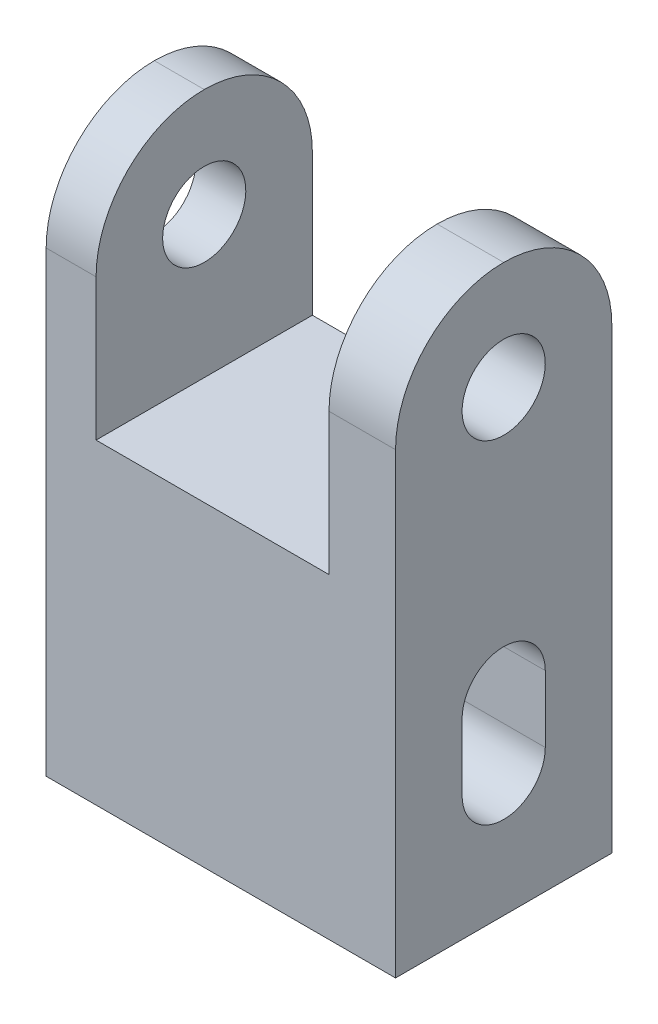
ISO-10303-21;
HEADER;
FILE_DESCRIPTION(('STEP AP214'),'2;1');
FILE_NAME('part.step','',(''),(''),'','','');
FILE_SCHEMA(('AUTOMOTIVE_DESIGN { 1 0 10303 214 1 1 1 1 }'));
ENDSEC;
DATA;
#1=APPLICATION_CONTEXT('core data for automotive mechanical design processes');
#2=APPLICATION_PROTOCOL_DEFINITION('international standard','automotive_design',2000,#1);
#3=PRODUCT_CONTEXT('',#1,'mechanical');
#4=PRODUCT('Part','Part','',(#3));
#5=PRODUCT_RELATED_PRODUCT_CATEGORY('part','',(#4));
#6=PRODUCT_DEFINITION_FORMATION('','',#4);
#7=PRODUCT_DEFINITION_CONTEXT('part definition',#1,'design');
#8=PRODUCT_DEFINITION('design','',#6,#7);
#9=PRODUCT_DEFINITION_SHAPE('','',#8);
#10=(LENGTH_UNIT() NAMED_UNIT(*) SI_UNIT(.MILLI.,.METRE.));
#11=(NAMED_UNIT(*) PLANE_ANGLE_UNIT() SI_UNIT($,.RADIAN.));
#12=(NAMED_UNIT(*) SI_UNIT($,.STERADIAN.) SOLID_ANGLE_UNIT());
#13=UNCERTAINTY_MEASURE_WITH_UNIT(LENGTH_MEASURE(1.E-05),#10,'distance_accuracy_value','');
#14=(GEOMETRIC_REPRESENTATION_CONTEXT(3) GLOBAL_UNCERTAINTY_ASSIGNED_CONTEXT((#13)) GLOBAL_UNIT_ASSIGNED_CONTEXT((#10,
#11,#12)) REPRESENTATION_CONTEXT('',''));
#15=CARTESIAN_POINT('',(0.,0.,0.));
#16=DIRECTION('',(0.,0.,1.));
#17=DIRECTION('',(1.,0.,0.));
#18=AXIS2_PLACEMENT_3D('',#15,#16,#17);
#19=CARTESIAN_POINT('',(0.,0.,13.));
#20=DIRECTION('',(1.,0.,0.));
#21=DIRECTION('',(0.,1.,0.));
#22=AXIS2_PLACEMENT_3D('',#19,#20,#21);
#23=PLANE('',#22);
#24=CARTESIAN_POINT('',(0.,-6.5,6.5));
#25=DIRECTION('',(1.,0.,0.));
#26=DIRECTION('',(0.,1.,0.));
#27=AXIS2_PLACEMENT_3D('',#24,#25,#26);
#28=CIRCLE('',#27,2.5);
#29=CARTESIAN_POINT('',(0.,-4.,6.5));
#30=VERTEX_POINT('',#29);
#31=EDGE_CURVE('E231',#30,#30,#28,.T.);
#32=ORIENTED_EDGE('',*,*,#31,.T.);
#33=EDGE_LOOP('',(#32));
#34=FACE_BOUND('',#33,.T.);
#35=DIRECTION('',(0.,1.,0.));
#36=VECTOR('',#35,1.);
#37=CARTESIAN_POINT('',(0.,-26.5,9.));
#38=LINE('',#37,#36);
#39=CARTESIAN_POINT('',(0.,-26.5,9.));
#40=VERTEX_POINT('',#39);
#41=CARTESIAN_POINT('',(0.,-22.5,9.));
#42=VERTEX_POINT('',#41);
#43=EDGE_CURVE('E178',#40,#42,#38,.T.);
#44=ORIENTED_EDGE('',*,*,#43,.F.);
#45=CARTESIAN_POINT('',(0.,-26.5,6.5));
#46=DIRECTION('',(-1.,0.,0.));
#47=DIRECTION('',(0.,-1.,0.));
#48=AXIS2_PLACEMENT_3D('',#45,#46,#47);
#49=CIRCLE('',#48,2.5);
#50=CARTESIAN_POINT('',(0.,-26.5,4.));
#51=VERTEX_POINT('',#50);
#52=EDGE_CURVE('E149',#51,#40,#49,.T.);
#53=ORIENTED_EDGE('',*,*,#52,.F.);
#54=DIRECTION('',(0.,1.,0.));
#55=VECTOR('',#54,1.);
#56=CARTESIAN_POINT('',(0.,-26.5,4.));
#57=LINE('',#56,#55);
#58=CARTESIAN_POINT('',(0.,-22.5,4.));
#59=VERTEX_POINT('',#58);
#60=EDGE_CURVE('E166',#51,#59,#57,.T.);
#61=ORIENTED_EDGE('',*,*,#60,.T.);
#62=CARTESIAN_POINT('',(0.,-22.5,6.5));
#63=DIRECTION('',(-1.,0.,0.));
#64=DIRECTION('',(0.,-1.,0.));
#65=AXIS2_PLACEMENT_3D('',#62,#63,#64);
#66=CIRCLE('',#65,2.5);
#67=EDGE_CURVE('E169',#42,#59,#66,.T.);
#68=ORIENTED_EDGE('',*,*,#67,.F.);
#69=EDGE_LOOP('',(#44,#53,#61,#68));
#70=FACE_BOUND('',#69,.T.);
#71=DIRECTION('',(0.,-1.,0.));
#72=VECTOR('',#71,1.);
#73=CARTESIAN_POINT('',(0.,0.,13.));
#74=LINE('',#73,#72);
#75=CARTESIAN_POINT('',(0.,-6.5,13.));
#76=VERTEX_POINT('',#75);
#77=CARTESIAN_POINT('',(0.,-34.,13.));
#78=VERTEX_POINT('',#77);
#79=EDGE_CURVE('E188',#76,#78,#74,.T.);
#80=ORIENTED_EDGE('',*,*,#79,.F.);
#81=CARTESIAN_POINT('',(0.,-6.5,6.5));
#82=DIRECTION('',(1.,0.,0.));
#83=DIRECTION('',(0.,1.,0.));
#84=AXIS2_PLACEMENT_3D('',#81,#82,#83);
#85=CIRCLE('',#84,6.5);
#86=CARTESIAN_POINT('',(0.,0.,6.5));
#87=VERTEX_POINT('',#86);
#88=EDGE_CURVE('E247',#76,#87,#85,.F.);
#89=ORIENTED_EDGE('',*,*,#88,.T.);
#90=CARTESIAN_POINT('',(0.,-6.5,6.5));
#91=DIRECTION('',(1.,0.,0.));
#92=DIRECTION('',(0.,1.,0.));
#93=AXIS2_PLACEMENT_3D('',#90,#91,#92);
#94=CIRCLE('',#93,6.5);
#95=CARTESIAN_POINT('',(0.,-6.5,0.));
#96=VERTEX_POINT('',#95);
#97=EDGE_CURVE('E245',#87,#96,#94,.F.);
#98=ORIENTED_EDGE('',*,*,#97,.T.);
#99=DIRECTION('',(0.,-1.,0.));
#100=VECTOR('',#99,1.);
#101=CARTESIAN_POINT('',(0.,0.,0.));
#102=LINE('',#101,#100);
#103=CARTESIAN_POINT('',(0.,-34.,0.));
#104=VERTEX_POINT('',#103);
#105=EDGE_CURVE('E184',#96,#104,#102,.T.);
#106=ORIENTED_EDGE('',*,*,#105,.T.);
#107=DIRECTION('',(0.,0.,-1.));
#108=VECTOR('',#107,1.);
#109=CARTESIAN_POINT('',(0.,-34.,13.));
#110=LINE('',#109,#108);
#111=EDGE_CURVE('E223',#78,#104,#110,.T.);
#112=ORIENTED_EDGE('',*,*,#111,.F.);
#113=EDGE_LOOP('',(#80,#89,#98,#106,#112));
#114=FACE_BOUND('',#113,.T.);
#115=ADVANCED_FACE('F35',(#34,#70,#114),#23,.F.);
#116=CARTESIAN_POINT('',(0.,-34.,13.));
#117=DIRECTION('',(0.,1.,0.));
#118=DIRECTION('',(0.,0.,1.));
#119=AXIS2_PLACEMENT_3D('',#116,#117,#118);
#120=PLANE('',#119);
#121=CARTESIAN_POINT('',(10.5,-34.,6.5));
#122=DIRECTION('',(0.,-1.,0.));
#123=DIRECTION('',(1.,0.,0.));
#124=AXIS2_PLACEMENT_3D('',#121,#122,#123);
#125=CIRCLE('',#124,2.);
#126=CARTESIAN_POINT('',(12.5,-34.,6.5));
#127=VERTEX_POINT('',#126);
#128=EDGE_CURVE('E260',#127,#127,#125,.T.);
#129=ORIENTED_EDGE('',*,*,#128,.F.);
#130=EDGE_LOOP('',(#129));
#131=FACE_BOUND('',#130,.T.);
#132=DIRECTION('',(1.,0.,0.));
#133=VECTOR('',#132,1.);
#134=CARTESIAN_POINT('',(0.,-34.,0.));
#135=LINE('',#134,#133);
#136=CARTESIAN_POINT('',(21.,-34.,0.));
#137=VERTEX_POINT('',#136);
#138=EDGE_CURVE('E205',#104,#137,#135,.T.);
#139=ORIENTED_EDGE('',*,*,#138,.T.);
#140=DIRECTION('',(0.,0.,-1.));
#141=VECTOR('',#140,1.);
#142=CARTESIAN_POINT('',(21.,-34.,13.));
#143=LINE('',#142,#141);
#144=CARTESIAN_POINT('',(21.,-34.,13.));
#145=VERTEX_POINT('',#144);
#146=EDGE_CURVE('E220',#145,#137,#143,.T.);
#147=ORIENTED_EDGE('',*,*,#146,.F.);
#148=DIRECTION('',(1.,0.,0.));
#149=VECTOR('',#148,1.);
#150=CARTESIAN_POINT('',(0.,-34.,13.));
#151=LINE('',#150,#149);
#152=EDGE_CURVE('E190',#78,#145,#151,.T.);
#153=ORIENTED_EDGE('',*,*,#152,.F.);
#154=ORIENTED_EDGE('',*,*,#111,.T.);
#155=EDGE_LOOP('',(#139,#147,#153,#154));
#156=FACE_BOUND('',#155,.T.);
#157=ADVANCED_FACE('F292',(#131,#156),#120,.F.);
#158=CARTESIAN_POINT('',(21.,-34.,13.));
#159=DIRECTION('',(-1.,0.,0.));
#160=DIRECTION('',(0.,-1.,0.));
#161=AXIS2_PLACEMENT_3D('',#158,#159,#160);
#162=PLANE('',#161);
#163=CARTESIAN_POINT('',(21.,-6.5,6.5));
#164=DIRECTION('',(-1.,0.,0.));
#165=DIRECTION('',(0.,-1.,0.));
#166=AXIS2_PLACEMENT_3D('',#163,#164,#165);
#167=CIRCLE('',#166,2.5);
#168=CARTESIAN_POINT('',(21.,-4.,6.5));
#169=VERTEX_POINT('',#168);
#170=EDGE_CURVE('E172',#169,#169,#167,.T.);
#171=ORIENTED_EDGE('',*,*,#170,.T.);
#172=EDGE_LOOP('',(#171));
#173=FACE_BOUND('',#172,.T.);
#174=DIRECTION('',(0.,1.,0.));
#175=VECTOR('',#174,1.);
#176=CARTESIAN_POINT('',(21.,-26.5,4.));
#177=LINE('',#176,#175);
#178=CARTESIAN_POINT('',(21.,-26.5,4.));
#179=VERTEX_POINT('',#178);
#180=CARTESIAN_POINT('',(21.,-22.5,4.));
#181=VERTEX_POINT('',#180);
#182=EDGE_CURVE('E154',#179,#181,#177,.T.);
#183=ORIENTED_EDGE('',*,*,#182,.F.);
#184=CARTESIAN_POINT('',(21.,-26.5,6.5));
#185=DIRECTION('',(-1.,0.,0.));
#186=DIRECTION('',(0.,-1.,0.));
#187=AXIS2_PLACEMENT_3D('',#184,#185,#186);
#188=CIRCLE('',#187,2.5);
#189=CARTESIAN_POINT('',(21.,-26.5,9.));
#190=VERTEX_POINT('',#189);
#191=EDGE_CURVE('E146',#179,#190,#188,.T.);
#192=ORIENTED_EDGE('',*,*,#191,.T.);
#193=DIRECTION('',(0.,1.,0.));
#194=VECTOR('',#193,1.);
#195=CARTESIAN_POINT('',(21.,-26.5,9.));
#196=LINE('',#195,#194);
#197=CARTESIAN_POINT('',(21.,-22.5,9.));
#198=VERTEX_POINT('',#197);
#199=EDGE_CURVE('E158',#190,#198,#196,.T.);
#200=ORIENTED_EDGE('',*,*,#199,.T.);
#201=CARTESIAN_POINT('',(21.,-22.5,6.5));
#202=DIRECTION('',(-1.,0.,0.));
#203=DIRECTION('',(0.,-1.,0.));
#204=AXIS2_PLACEMENT_3D('',#201,#202,#203);
#205=CIRCLE('',#204,2.5);
#206=EDGE_CURVE('E162',#198,#181,#205,.T.);
#207=ORIENTED_EDGE('',*,*,#206,.T.);
#208=EDGE_LOOP('',(#183,#192,#200,#207));
#209=FACE_BOUND('',#208,.T.);
#210=CARTESIAN_POINT('',(21.,-6.5,6.5));
#211=DIRECTION('',(-1.,0.,0.));
#212=DIRECTION('',(0.,-1.,0.));
#213=AXIS2_PLACEMENT_3D('',#210,#211,#212);
#214=CIRCLE('',#213,6.5);
#215=CARTESIAN_POINT('',(21.,-6.5,0.));
#216=VERTEX_POINT('',#215);
#217=CARTESIAN_POINT('',(21.,0.,6.5));
#218=VERTEX_POINT('',#217);
#219=EDGE_CURVE('E241',#216,#218,#214,.F.);
#220=ORIENTED_EDGE('',*,*,#219,.T.);
#221=CARTESIAN_POINT('',(21.,-6.5,6.5));
#222=DIRECTION('',(-1.,0.,0.));
#223=DIRECTION('',(0.,-1.,0.));
#224=AXIS2_PLACEMENT_3D('',#221,#222,#223);
#225=CIRCLE('',#224,6.5);
#226=CARTESIAN_POINT('',(21.,-6.5,13.));
#227=VERTEX_POINT('',#226);
#228=EDGE_CURVE('E243',#218,#227,#225,.F.);
#229=ORIENTED_EDGE('',*,*,#228,.T.);
#230=DIRECTION('',(0.,1.,0.));
#231=VECTOR('',#230,1.);
#232=CARTESIAN_POINT('',(21.,-34.,13.));
#233=LINE('',#232,#231);
#234=EDGE_CURVE('E193',#145,#227,#233,.T.);
#235=ORIENTED_EDGE('',*,*,#234,.F.);
#236=ORIENTED_EDGE('',*,*,#146,.T.);
#237=DIRECTION('',(0.,1.,0.));
#238=VECTOR('',#237,1.);
#239=CARTESIAN_POINT('',(21.,-34.,0.));
#240=LINE('',#239,#238);
#241=EDGE_CURVE('E207',#137,#216,#240,.T.);
#242=ORIENTED_EDGE('',*,*,#241,.T.);
#243=EDGE_LOOP('',(#220,#229,#235,#236,#242));
#244=FACE_BOUND('',#243,.T.);
#245=ADVANCED_FACE('F164',(#173,#209,#244),#162,.F.);
#246=CARTESIAN_POINT('',(17.,0.,13.));
#247=DIRECTION('',(1.,0.,0.));
#248=DIRECTION('',(0.,0.,-1.));
#249=AXIS2_PLACEMENT_3D('',#246,#247,#248);
#250=PLANE('',#249);
#251=CARTESIAN_POINT('',(17.,-6.5,6.5));
#252=DIRECTION('',(1.,0.,0.));
#253=DIRECTION('',(0.,0.,-1.));
#254=AXIS2_PLACEMENT_3D('',#251,#252,#253);
#255=CIRCLE('',#254,2.5);
#256=CARTESIAN_POINT('',(17.,-4.,6.5));
#257=VERTEX_POINT('',#256);
#258=EDGE_CURVE('E230',#257,#257,#255,.T.);
#259=ORIENTED_EDGE('',*,*,#258,.T.);
#260=EDGE_LOOP('',(#259));
#261=FACE_BOUND('',#260,.T.);
#262=DIRECTION('',(0.,-1.,0.));
#263=VECTOR('',#262,1.);
#264=CARTESIAN_POINT('',(17.,0.,13.));
#265=LINE('',#264,#263);
#266=CARTESIAN_POINT('',(17.,-6.5,13.));
#267=VERTEX_POINT('',#266);
#268=CARTESIAN_POINT('',(17.,-15.,13.));
#269=VERTEX_POINT('',#268);
#270=EDGE_CURVE('E196',#267,#269,#265,.T.);
#271=ORIENTED_EDGE('',*,*,#270,.F.);
#272=CARTESIAN_POINT('',(17.,-6.5,6.5));
#273=DIRECTION('',(1.,0.,0.));
#274=DIRECTION('',(0.,0.,-1.));
#275=AXIS2_PLACEMENT_3D('',#272,#273,#274);
#276=CIRCLE('',#275,6.5);
#277=CARTESIAN_POINT('',(17.,0.,6.5));
#278=VERTEX_POINT('',#277);
#279=EDGE_CURVE('E239',#267,#278,#276,.F.);
#280=ORIENTED_EDGE('',*,*,#279,.T.);
#281=CARTESIAN_POINT('',(17.,-6.5,6.5));
#282=DIRECTION('',(1.,0.,0.));
#283=DIRECTION('',(0.,0.,-1.));
#284=AXIS2_PLACEMENT_3D('',#281,#282,#283);
#285=CIRCLE('',#284,6.5);
#286=CARTESIAN_POINT('',(17.,-6.5,0.));
#287=VERTEX_POINT('',#286);
#288=EDGE_CURVE('E237',#278,#287,#285,.F.);
#289=ORIENTED_EDGE('',*,*,#288,.T.);
#290=DIRECTION('',(0.,-1.,0.));
#291=VECTOR('',#290,1.);
#292=CARTESIAN_POINT('',(17.,0.,0.));
#293=LINE('',#292,#291);
#294=CARTESIAN_POINT('',(17.,-15.,0.));
#295=VERTEX_POINT('',#294);
#296=EDGE_CURVE('E210',#287,#295,#293,.T.);
#297=ORIENTED_EDGE('',*,*,#296,.T.);
#298=DIRECTION('',(0.,0.,-1.));
#299=VECTOR('',#298,1.);
#300=CARTESIAN_POINT('',(17.,-15.,13.));
#301=LINE('',#300,#299);
#302=EDGE_CURVE('E217',#269,#295,#301,.T.);
#303=ORIENTED_EDGE('',*,*,#302,.F.);
#304=EDGE_LOOP('',(#271,#280,#289,#297,#303));
#305=FACE_BOUND('',#304,.T.);
#306=ADVANCED_FACE('F344',(#261,#305),#250,.F.);
#307=CARTESIAN_POINT('',(17.,-15.,13.));
#308=DIRECTION('',(0.,-1.,0.));
#309=DIRECTION('',(1.,0.,0.));
#310=AXIS2_PLACEMENT_3D('',#307,#308,#309);
#311=PLANE('',#310);
#312=DIRECTION('',(-1.,0.,0.));
#313=VECTOR('',#312,1.);
#314=CARTESIAN_POINT('',(17.,-15.,0.));
#315=LINE('',#314,#313);
#316=CARTESIAN_POINT('',(3.,-15.,0.));
#317=VERTEX_POINT('',#316);
#318=EDGE_CURVE('E212',#295,#317,#315,.T.);
#319=ORIENTED_EDGE('',*,*,#318,.T.);
#320=DIRECTION('',(0.,0.,-1.));
#321=VECTOR('',#320,1.);
#322=CARTESIAN_POINT('',(3.,-15.,13.));
#323=LINE('',#322,#321);
#324=CARTESIAN_POINT('',(3.,-15.,13.));
#325=VERTEX_POINT('',#324);
#326=EDGE_CURVE('E203',#325,#317,#323,.T.);
#327=ORIENTED_EDGE('',*,*,#326,.F.);
#328=DIRECTION('',(-1.,0.,0.));
#329=VECTOR('',#328,1.);
#330=CARTESIAN_POINT('',(17.,-15.,13.));
#331=LINE('',#330,#329);
#332=EDGE_CURVE('E198',#269,#325,#331,.T.);
#333=ORIENTED_EDGE('',*,*,#332,.F.);
#334=ORIENTED_EDGE('',*,*,#302,.T.);
#335=EDGE_LOOP('',(#319,#327,#333,#334));
#336=FACE_BOUND('',#335,.T.);
#337=ADVANCED_FACE('F324',(#336),#311,.F.);
#338=CARTESIAN_POINT('',(3.,-15.,13.));
#339=DIRECTION('',(-1.,0.,0.));
#340=DIRECTION('',(0.,0.,1.));
#341=AXIS2_PLACEMENT_3D('',#338,#339,#340);
#342=PLANE('',#341);
#343=CARTESIAN_POINT('',(3.,-6.5,6.5));
#344=DIRECTION('',(-1.,0.,0.));
#345=DIRECTION('',(0.,0.,1.));
#346=AXIS2_PLACEMENT_3D('',#343,#344,#345);
#347=CIRCLE('',#346,2.5);
#348=CARTESIAN_POINT('',(3.,-6.5,9.));
#349=VERTEX_POINT('',#348);
#350=EDGE_CURVE('E227',#349,#349,#347,.T.);
#351=ORIENTED_EDGE('',*,*,#350,.T.);
#352=EDGE_LOOP('',(#351));
#353=FACE_BOUND('',#352,.T.);
#354=CARTESIAN_POINT('',(3.,-6.5,6.5));
#355=DIRECTION('',(-1.,0.,0.));
#356=DIRECTION('',(0.,0.,1.));
#357=AXIS2_PLACEMENT_3D('',#354,#355,#356);
#358=CIRCLE('',#357,6.5);
#359=CARTESIAN_POINT('',(3.,-6.5,0.));
#360=VERTEX_POINT('',#359);
#361=CARTESIAN_POINT('',(3.,0.,6.5));
#362=VERTEX_POINT('',#361);
#363=EDGE_CURVE('E56',#360,#362,#358,.F.);
#364=ORIENTED_EDGE('',*,*,#363,.T.);
#365=CARTESIAN_POINT('',(3.,-6.5,6.5));
#366=DIRECTION('',(-1.,0.,0.));
#367=DIRECTION('',(0.,0.,1.));
#368=AXIS2_PLACEMENT_3D('',#365,#366,#367);
#369=CIRCLE('',#368,6.5);
#370=CARTESIAN_POINT('',(3.,-6.5,13.));
#371=VERTEX_POINT('',#370);
#372=EDGE_CURVE('E250',#362,#371,#369,.F.);
#373=ORIENTED_EDGE('',*,*,#372,.T.);
#374=DIRECTION('',(0.,1.,0.));
#375=VECTOR('',#374,1.);
#376=CARTESIAN_POINT('',(3.,-15.,13.));
#377=LINE('',#376,#375);
#378=EDGE_CURVE('E200',#325,#371,#377,.T.);
#379=ORIENTED_EDGE('',*,*,#378,.F.);
#380=ORIENTED_EDGE('',*,*,#326,.T.);
#381=DIRECTION('',(0.,1.,0.));
#382=VECTOR('',#381,1.);
#383=CARTESIAN_POINT('',(3.,-15.,0.));
#384=LINE('',#383,#382);
#385=EDGE_CURVE('E191',#317,#360,#384,.T.);
#386=ORIENTED_EDGE('',*,*,#385,.T.);
#387=EDGE_LOOP('',(#364,#373,#379,#380,#386));
#388=FACE_BOUND('',#387,.T.);
#389=ADVANCED_FACE('F315',(#353,#388),#342,.F.);
#390=CARTESIAN_POINT('',(0.,0.,13.));
#391=DIRECTION('',(0.,0.,1.));
#392=DIRECTION('',(1.,0.,0.));
#393=AXIS2_PLACEMENT_3D('',#390,#391,#392);
#394=PLANE('',#393);
#395=ORIENTED_EDGE('',*,*,#234,.T.);
#396=DIRECTION('',(-1.,0.,0.));
#397=VECTOR('',#396,1.);
#398=CARTESIAN_POINT('',(17.,-6.5,13.));
#399=LINE('',#398,#397);
#400=EDGE_CURVE('E234',#227,#267,#399,.T.);
#401=ORIENTED_EDGE('',*,*,#400,.T.);
#402=ORIENTED_EDGE('',*,*,#270,.T.);
#403=ORIENTED_EDGE('',*,*,#332,.T.);
#404=ORIENTED_EDGE('',*,*,#378,.T.);
#405=DIRECTION('',(-1.,0.,0.));
#406=VECTOR('',#405,1.);
#407=CARTESIAN_POINT('',(0.,-6.5,13.));
#408=LINE('',#407,#406);
#409=EDGE_CURVE('E226',#371,#76,#408,.T.);
#410=ORIENTED_EDGE('',*,*,#409,.T.);
#411=ORIENTED_EDGE('',*,*,#79,.T.);
#412=ORIENTED_EDGE('',*,*,#152,.T.);
#413=EDGE_LOOP('',(#395,#401,#402,#403,#404,#410,#411,#412));
#414=FACE_BOUND('',#413,.T.);
#415=ADVANCED_FACE('F317',(#414),#394,.T.);
#416=CARTESIAN_POINT('',(0.,0.,0.));
#417=DIRECTION('',(0.,0.,1.));
#418=DIRECTION('',(1.,0.,0.));
#419=AXIS2_PLACEMENT_3D('',#416,#417,#418);
#420=PLANE('',#419);
#421=ORIENTED_EDGE('',*,*,#105,.F.);
#422=DIRECTION('',(-1.,0.,0.));
#423=VECTOR('',#422,1.);
#424=CARTESIAN_POINT('',(0.,-6.5,0.));
#425=LINE('',#424,#423);
#426=EDGE_CURVE('E11',#96,#360,#425,.F.);
#427=ORIENTED_EDGE('',*,*,#426,.T.);
#428=ORIENTED_EDGE('',*,*,#385,.F.);
#429=ORIENTED_EDGE('',*,*,#318,.F.);
#430=ORIENTED_EDGE('',*,*,#296,.F.);
#431=DIRECTION('',(-1.,0.,0.));
#432=VECTOR('',#431,1.);
#433=CARTESIAN_POINT('',(0.,-6.5,0.));
#434=LINE('',#433,#432);
#435=EDGE_CURVE('E48',#287,#216,#434,.F.);
#436=ORIENTED_EDGE('',*,*,#435,.T.);
#437=ORIENTED_EDGE('',*,*,#241,.F.);
#438=ORIENTED_EDGE('',*,*,#138,.F.);
#439=EDGE_LOOP('',(#421,#427,#428,#429,#430,#436,#437,#438));
#440=FACE_BOUND('',#439,.T.);
#441=ADVANCED_FACE('F326',(#440),#420,.F.);
#442=CARTESIAN_POINT('',(21.,-26.5,6.5));
#443=DIRECTION('',(-1.,0.,0.));
#444=DIRECTION('',(0.,-1.,0.));
#445=AXIS2_PLACEMENT_3D('',#442,#443,#444);
#446=CYLINDRICAL_SURFACE('',#445,2.5);
#447=CARTESIAN_POINT('',(12.5,-29.,6.5));
#448=CARTESIAN_POINT('',(12.4999924205671,-28.999992649474,6.59599689643887));
#449=CARTESIAN_POINT('',(12.4930305713365,-28.9944136841191,6.69213319296467));
#450=CARTESIAN_POINT('',(12.4656500599583,-28.972592693606,6.88131936547741));
#451=CARTESIAN_POINT('',(12.4452016287381,-28.9563270800038,6.97436193432134));
#452=CARTESIAN_POINT('',(12.3923217211049,-28.9146672181517,7.15409491682451));
#453=CARTESIAN_POINT('',(12.3599666485686,-28.8893312014417,7.24082169812805));
#454=CARTESIAN_POINT('',(12.2848826565227,-28.831360109966,7.40692632369254));
#455=CARTESIAN_POINT('',(12.2421537041494,-28.7987250120775,7.48630414467151));
#456=CARTESIAN_POINT('',(12.1313716349689,-28.7157566472895,7.66318123656703));
#457=CARTESIAN_POINT('',(12.0596810848259,-28.6632174860322,7.75736767952115));
#458=CARTESIAN_POINT('',(11.9027219342605,-28.5529219260303,7.93041367827883));
#459=CARTESIAN_POINT('',(11.8174142464966,-28.4951507220051,8.00922761533153));
#460=CARTESIAN_POINT('',(11.6332260159273,-28.3785600162983,8.1521591895554));
#461=CARTESIAN_POINT('',(11.5341532270239,-28.3197383090203,8.21602638457222));
#462=CARTESIAN_POINT('',(11.3234612174958,-28.2088210988299,8.32646834413604));
#463=CARTESIAN_POINT('',(11.211885666112,-28.1567034708917,8.37310099386401));
#464=CARTESIAN_POINT('',(11.026121048323,-28.0883565230093,8.43086043771819));
#465=CARTESIAN_POINT('',(10.9561882620197,-28.0662872777019,8.44865475820658));
#466=CARTESIAN_POINT('',(10.8127873158795,-28.0306988915583,8.47673396798331));
#467=CARTESIAN_POINT('',(10.739328326475,-28.0171587417974,8.48703731881776));
#468=CARTESIAN_POINT('',(10.589807481129,-28.000842340611,8.49939840142554));
#469=CARTESIAN_POINT('',(10.5137285151792,-27.9981609692656,8.50138345613423));
#470=CARTESIAN_POINT('',(10.3622951079673,-28.0043996230281,8.49669481699686));
#471=CARTESIAN_POINT('',(10.2869413342337,-28.0133294666024,8.49001379511087));
#472=CARTESIAN_POINT('',(10.1277776973873,-28.0432072129997,8.4669530271194));
#473=CARTESIAN_POINT('',(10.044491993946,-28.0658184204953,8.44921808205621));
#474=CARTESIAN_POINT('',(9.88346444046298,-28.1199745993628,8.40444547348848));
#475=CARTESIAN_POINT('',(9.80573984346019,-28.1515459819864,8.37738025642251));
#476=CARTESIAN_POINT('',(9.61933789395903,-28.2365611615942,8.29974102194077));
#477=CARTESIAN_POINT('',(9.51419730169583,-28.2931337296815,8.24414886595504));
#478=CARTESIAN_POINT('',(9.31628332220068,-28.4091378006069,8.11638467497537));
#479=CARTESIAN_POINT('',(9.22352827915647,-28.4685733704894,8.04418846902465));
#480=CARTESIAN_POINT('',(9.04872522859494,-28.5861275196845,7.88145818326396));
#481=CARTESIAN_POINT('',(8.96702807769424,-28.6441688926078,7.79048701026967));
#482=CARTESIAN_POINT('',(8.8199005005657,-28.7517187149499,7.59198491072667));
#483=CARTESIAN_POINT('',(8.75442648388278,-28.8012499182245,7.48449964520108));
#484=CARTESIAN_POINT('',(8.65943715259012,-28.8742458564332,7.28777781438056));
#485=CARTESIAN_POINT('',(8.62499549556094,-28.9011107122417,7.20217772732921));
#486=CARTESIAN_POINT('',(8.56787354901204,-28.9459756411142,7.02491392373715));
#487=CARTESIAN_POINT('',(8.54518439505453,-28.9639823949691,6.93325483627229));
#488=CARTESIAN_POINT('',(8.51286145306422,-28.9897033568521,6.74571323384493));
#489=CARTESIAN_POINT('',(8.50329587525505,-28.9973637863367,6.64981130721262));
#490=CARTESIAN_POINT('',(8.49814095102372,-29.0014868270186,6.45739199713248));
#491=CARTESIAN_POINT('',(8.50254900117795,-28.9979515240906,6.36087473167204));
#492=CARTESIAN_POINT('',(8.52408281624769,-28.9807685864295,6.17825332584454));
#493=CARTESIAN_POINT('',(8.54014917513902,-28.9679635240506,6.09193910824343));
#494=CARTESIAN_POINT('',(8.58287218110157,-28.9341751321347,5.92366432577128));
#495=CARTESIAN_POINT('',(8.60953197109663,-28.9131893755344,5.84170506114306));
#496=CARTESIAN_POINT('',(8.67415037178394,-28.8628984943133,5.67876412245109));
#497=CARTESIAN_POINT('',(8.71270578595637,-28.8331591273687,5.59815638058094));
#498=CARTESIAN_POINT('',(8.7988621516328,-28.7678362272214,5.44458999551669));
#499=CARTESIAN_POINT('',(8.84646355423456,-28.7322524025842,5.37163173406212));
#500=CARTESIAN_POINT('',(8.95922431829688,-28.649936875224,5.22074762430857));
#501=CARTESIAN_POINT('',(9.02600169048301,-28.6023696976822,5.14449281021871));
#502=CARTESIAN_POINT('',(9.169386961371,-28.5044349795202,5.0034631240247));
#503=CARTESIAN_POINT('',(9.24602283683884,-28.454059709911,4.93872222272633));
#504=CARTESIAN_POINT('',(9.3764344432366,-28.3737413531714,4.84431512069213));
#505=CARTESIAN_POINT('',(9.42736059075334,-28.3435474368546,4.81086258207348));
#506=CARTESIAN_POINT('',(9.5326222614236,-28.2843541552113,4.74844998079457));
#507=CARTESIAN_POINT('',(9.5869595718808,-28.2553554295189,4.71949230131024));
#508=CARTESIAN_POINT('',(9.69887484028167,-28.19983828793,4.66641910040183));
#509=CARTESIAN_POINT('',(9.7564397672437,-28.1733109077483,4.64228568312346));
#510=CARTESIAN_POINT('',(9.875008978504,-28.1241020986769,4.59911518041365));
#511=CARTESIAN_POINT('',(9.93601073751955,-28.1014178938043,4.5800744106845));
#512=CARTESIAN_POINT('',(10.0660867242378,-28.0601942022258,4.54639834110917));
#513=CARTESIAN_POINT('',(10.1354226649404,-28.0420971671477,4.53220440275001));
#514=CARTESIAN_POINT('',(10.2768376127381,-28.0149337159379,4.51121094380633));
#515=CARTESIAN_POINT('',(10.3489092204505,-28.0058445230752,4.50439276925242));
#516=CARTESIAN_POINT('',(10.4943487054641,-27.9982473677972,4.49867941283454));
#517=CARTESIAN_POINT('',(10.5677214541542,-27.9997962591844,4.49982680220211));
#518=CARTESIAN_POINT('',(10.7129841930231,-28.0133077169599,4.51003480455797));
#519=CARTESIAN_POINT('',(10.7848716473261,-28.0252867934739,4.51910796346213));
#520=CARTESIAN_POINT('',(10.9446067743446,-28.0620707675608,4.54792254247285));
#521=CARTESIAN_POINT('',(11.0314230824911,-28.0894925841937,4.56990769591358));
#522=CARTESIAN_POINT('',(11.1986334786897,-28.1528890764241,4.62391822782569));
#523=CARTESIAN_POINT('',(11.2790077600367,-28.1888888721129,4.65597318457436));
#524=CARTESIAN_POINT('',(11.4121777220462,-28.2549115872444,4.71905253688533));
#525=CARTESIAN_POINT('',(11.4665191815183,-28.2838890732501,4.74797636809591));
#526=CARTESIAN_POINT('',(11.5718382298173,-28.34307948739,4.81035266217538));
#527=CARTESIAN_POINT('',(11.6228145849512,-28.3732928621151,4.84380677234097));
#528=CARTESIAN_POINT('',(11.7707794032988,-28.4643799775812,4.9508156442929));
#529=CARTESIAN_POINT('',(11.8627986866625,-28.525698084814,5.03101458359491));
#530=CARTESIAN_POINT('',(12.0333894648308,-28.6441827878711,5.2099828114157));
#531=CARTESIAN_POINT('',(12.1117702242368,-28.701284919641,5.30898033842352));
#532=CARTESIAN_POINT('',(12.2155767294168,-28.7787465080453,5.47001600100454));
#533=CARTESIAN_POINT('',(12.2478684441351,-28.8031886810933,5.52574459980031));
#534=CARTESIAN_POINT('',(12.3073681009614,-28.848661154656,5.64114517137196));
#535=CARTESIAN_POINT('',(12.3345791544845,-28.8696935422891,5.70081470019465));
#536=CARTESIAN_POINT('',(12.3917800598956,-28.914209055115,5.84496226057576));
#537=CARTESIAN_POINT('',(12.4194826718009,-28.9360289288763,5.93088976040989));
#538=CARTESIAN_POINT('',(12.4631576733877,-28.9705886497684,6.10728690257229));
#539=CARTESIAN_POINT('',(12.4791607887746,-28.9833522781687,6.19774397589687));
#540=CARTESIAN_POINT('',(12.4925630255603,-28.994053783091,6.3241190690801));
#541=CARTESIAN_POINT('',(12.4953473787458,-28.9962791876343,6.35919144717873));
#542=CARTESIAN_POINT('',(12.4990674635275,-28.999253810179,6.42950292510818));
#543=CARTESIAN_POINT('',(12.5000027837899,-29.0000026997165,6.46474206028827));
#544=CARTESIAN_POINT('',(12.5,-29.,6.5));
#545=B_SPLINE_CURVE_WITH_KNOTS('',3,(#447,#448,#449,#450,#451,#452,#453,#454,#455,#456,#457,
#458,#459,#460,#461,#462,#463,#464,#465,#466,#467,#468,#469,#470,#471,#472,#473,#474,#475,#476,
#477,#478,#479,#480,#481,#482,#483,#484,#485,#486,#487,#488,#489,#490,#491,#492,#493,#494,#495,
#496,#497,#498,#499,#500,#501,#502,#503,#504,#505,#506,#507,#508,#509,#510,#511,#512,#513,#514,
#515,#516,#517,#518,#519,#520,#521,#522,#523,#524,#525,#526,#527,#528,#529,#530,#531,#532,#533,
#534,#535,#536,#537,#538,#539,#540,#541,#542,#543,#544),.UNSPECIFIED.,.T.,.F.,(4,2,2,2,2,2,2,2,
2,2,2,2,2,2,2,2,2,2,2,2,2,2,2,2,2,2,2,2,2,2,2,2,2,2,2,2,2,2,2,2,2,2,2,2,2,2,2,2,4),(0.,
0.287836605992208,0.576310692639342,0.862965057250605,1.14962032997081,1.53607888200101,
1.92366738187851,2.31734741765481,2.70969292925127,2.9353448634113,3.16043877408111,
3.38749528500759,3.61474392028823,3.8775863003201,4.14121163495705,4.534257481883,
4.92787915886674,5.33198173288419,5.73498644040676,6.02213978124802,6.30907621738868,
6.59749843639964,6.88586692268771,7.15087004938159,7.41595185759573,7.69742753051566,
7.9789172435135,8.31365537249325,8.64936529970902,8.85316560745906,9.0570736038085,
9.26021055202078,9.46320013996582,9.68152133432596,9.89928907450684,10.1182215471168,
10.3375012031536,10.616933053181,10.8971934831173,11.1010640012511,11.3050088506911,
11.7129165318148,12.1261363563906,12.3324811048119,12.5386990694968,12.8161540735934,
13.0928777702216,13.1985714874516,13.3042887145431),.UNSPECIFIED.);
#546=CARTESIAN_POINT('',(12.5,-29.,6.5));
#547=VERTEX_POINT('',#546);
#548=EDGE_CURVE('E39',#547,#547,#545,.T.);
#549=ORIENTED_EDGE('',*,*,#548,.T.);
#550=EDGE_LOOP('',(#549));
#551=FACE_BOUND('',#550,.T.);
#552=ORIENTED_EDGE('',*,*,#52,.T.);
#553=DIRECTION('',(-1.,0.,0.));
#554=VECTOR('',#553,1.);
#555=CARTESIAN_POINT('',(21.,-26.5,9.));
#556=LINE('',#555,#554);
#557=EDGE_CURVE('E142',#190,#40,#556,.T.);
#558=ORIENTED_EDGE('',*,*,#557,.F.);
#559=ORIENTED_EDGE('',*,*,#191,.F.);
#560=DIRECTION('',(-1.,0.,0.));
#561=VECTOR('',#560,1.);
#562=CARTESIAN_POINT('',(21.,-26.5,4.));
#563=LINE('',#562,#561);
#564=EDGE_CURVE('E182',#179,#51,#563,.T.);
#565=ORIENTED_EDGE('',*,*,#564,.T.);
#566=EDGE_LOOP('',(#552,#558,#559,#565));
#567=FACE_BOUND('',#566,.T.);
#568=ADVANCED_FACE('F144',(#551,#567),#446,.F.);
#569=CARTESIAN_POINT('',(21.,-26.5,4.));
#570=DIRECTION('',(0.,0.,1.));
#571=DIRECTION('',(0.,-1.,0.));
#572=AXIS2_PLACEMENT_3D('',#569,#570,#571);
#573=PLANE('',#572);
#574=ORIENTED_EDGE('',*,*,#60,.F.);
#575=ORIENTED_EDGE('',*,*,#564,.F.);
#576=ORIENTED_EDGE('',*,*,#182,.T.);
#577=DIRECTION('',(-1.,0.,0.));
#578=VECTOR('',#577,1.);
#579=CARTESIAN_POINT('',(21.,-22.5,4.));
#580=LINE('',#579,#578);
#581=EDGE_CURVE('E185',#181,#59,#580,.T.);
#582=ORIENTED_EDGE('',*,*,#581,.T.);
#583=EDGE_LOOP('',(#574,#575,#576,#582));
#584=FACE_BOUND('',#583,.T.);
#585=ADVANCED_FACE('F362',(#584),#573,.T.);
#586=CARTESIAN_POINT('',(21.,-22.5,6.5));
#587=DIRECTION('',(-1.,0.,0.));
#588=DIRECTION('',(0.,-1.,0.));
#589=AXIS2_PLACEMENT_3D('',#586,#587,#588);
#590=CYLINDRICAL_SURFACE('',#589,2.5);
#591=ORIENTED_EDGE('',*,*,#67,.T.);
#592=ORIENTED_EDGE('',*,*,#581,.F.);
#593=ORIENTED_EDGE('',*,*,#206,.F.);
#594=DIRECTION('',(-1.,0.,0.));
#595=VECTOR('',#594,1.);
#596=CARTESIAN_POINT('',(21.,-22.5,9.));
#597=LINE('',#596,#595);
#598=EDGE_CURVE('E153',#198,#42,#597,.T.);
#599=ORIENTED_EDGE('',*,*,#598,.T.);
#600=EDGE_LOOP('',(#591,#592,#593,#599));
#601=FACE_BOUND('',#600,.T.);
#602=ADVANCED_FACE('F365',(#601),#590,.F.);
#603=CARTESIAN_POINT('',(21.,-26.5,9.));
#604=DIRECTION('',(0.,0.,1.));
#605=DIRECTION('',(1.,0.,0.));
#606=AXIS2_PLACEMENT_3D('',#603,#604,#605);
#607=PLANE('',#606);
#608=ORIENTED_EDGE('',*,*,#43,.T.);
#609=ORIENTED_EDGE('',*,*,#598,.F.);
#610=ORIENTED_EDGE('',*,*,#199,.F.);
#611=ORIENTED_EDGE('',*,*,#557,.T.);
#612=EDGE_LOOP('',(#608,#609,#610,#611));
#613=FACE_BOUND('',#612,.T.);
#614=ADVANCED_FACE('F159',(#613),#607,.F.);
#615=CARTESIAN_POINT('',(0.,-6.5,6.5));
#616=DIRECTION('',(1.,0.,0.));
#617=DIRECTION('',(0.,1.,0.));
#618=AXIS2_PLACEMENT_3D('',#615,#616,#617);
#619=CYLINDRICAL_SURFACE('',#618,2.5);
#620=ORIENTED_EDGE('',*,*,#31,.F.);
#621=EDGE_LOOP('',(#620));
#622=FACE_BOUND('',#621,.T.);
#623=ORIENTED_EDGE('',*,*,#350,.F.);
#624=EDGE_LOOP('',(#623));
#625=FACE_BOUND('',#624,.T.);
#626=ADVANCED_FACE('F279',(#622,#625),#619,.F.);
#627=CARTESIAN_POINT('',(17.,-4.,6.5));
#628=CARTESIAN_POINT('',(17.0416666666667,-4.,6.5));
#629=CARTESIAN_POINT('',(17.0833333333333,-4.,6.5));
#630=CARTESIAN_POINT('',(17.1666666666667,-4.,6.5));
#631=CARTESIAN_POINT('',(17.2083333333333,-4.,6.5));
#632=CARTESIAN_POINT('',(17.2916666666667,-4.,6.5));
#633=CARTESIAN_POINT('',(17.3333333333333,-4.,6.5));
#634=CARTESIAN_POINT('',(17.4166666666667,-4.,6.5));
#635=CARTESIAN_POINT('',(17.4583333333333,-4.,6.5));
#636=CARTESIAN_POINT('',(17.5416666666667,-4.,6.5));
#637=CARTESIAN_POINT('',(17.5833333333333,-4.,6.5));
#638=CARTESIAN_POINT('',(17.6666666666667,-4.,6.5));
#639=CARTESIAN_POINT('',(17.7083333333333,-4.,6.5));
#640=CARTESIAN_POINT('',(17.7916666666667,-4.,6.5));
#641=CARTESIAN_POINT('',(17.8333333333333,-4.,6.5));
#642=CARTESIAN_POINT('',(17.9166666666667,-4.,6.5));
#643=CARTESIAN_POINT('',(17.9583333333333,-4.,6.5));
#644=CARTESIAN_POINT('',(18.0416666666667,-4.,6.5));
#645=CARTESIAN_POINT('',(18.0833333333333,-4.,6.5));
#646=CARTESIAN_POINT('',(18.1666666666667,-4.,6.5));
#647=CARTESIAN_POINT('',(18.2083333333333,-4.,6.5));
#648=CARTESIAN_POINT('',(18.2916666666667,-4.,6.5));
#649=CARTESIAN_POINT('',(18.3333333333333,-4.,6.5));
#650=CARTESIAN_POINT('',(18.4166666666667,-4.,6.5));
#651=CARTESIAN_POINT('',(18.4583333333333,-4.,6.5));
#652=CARTESIAN_POINT('',(18.5416666666667,-4.,6.5));
#653=CARTESIAN_POINT('',(18.5833333333333,-4.,6.5));
#654=CARTESIAN_POINT('',(18.6666666666667,-4.,6.5));
#655=CARTESIAN_POINT('',(18.7083333333333,-4.,6.5));
#656=CARTESIAN_POINT('',(18.7916666666667,-4.,6.5));
#657=CARTESIAN_POINT('',(18.8333333333333,-4.,6.5));
#658=CARTESIAN_POINT('',(18.9166666666667,-4.,6.5));
#659=CARTESIAN_POINT('',(18.9583333333333,-4.,6.5));
#660=CARTESIAN_POINT('',(19.0416666666667,-4.,6.5));
#661=CARTESIAN_POINT('',(19.0833333333333,-4.,6.5));
#662=CARTESIAN_POINT('',(19.1666666666667,-4.,6.5));
#663=CARTESIAN_POINT('',(19.2083333333333,-4.,6.5));
#664=CARTESIAN_POINT('',(19.2916666666667,-4.,6.5));
#665=CARTESIAN_POINT('',(19.3333333333333,-4.,6.5));
#666=CARTESIAN_POINT('',(19.4166666666667,-4.,6.5));
#667=CARTESIAN_POINT('',(19.4583333333333,-4.,6.5));
#668=CARTESIAN_POINT('',(19.5416666666667,-4.,6.5));
#669=CARTESIAN_POINT('',(19.5833333333333,-4.,6.5));
#670=CARTESIAN_POINT('',(19.6666666666667,-4.,6.5));
#671=CARTESIAN_POINT('',(19.7083333333333,-4.,6.5));
#672=CARTESIAN_POINT('',(19.7916666666667,-4.,6.5));
#673=CARTESIAN_POINT('',(19.8333333333333,-4.,6.5));
#674=CARTESIAN_POINT('',(19.9166666666667,-4.,6.5));
#675=CARTESIAN_POINT('',(19.9583333333333,-4.,6.5));
#676=CARTESIAN_POINT('',(20.0416666666667,-4.,6.5));
#677=CARTESIAN_POINT('',(20.0833333333333,-4.,6.5));
#678=CARTESIAN_POINT('',(20.1666666666667,-4.,6.5));
#679=CARTESIAN_POINT('',(20.2083333333333,-4.,6.5));
#680=CARTESIAN_POINT('',(20.2916666666667,-4.,6.5));
#681=CARTESIAN_POINT('',(20.3333333333333,-4.,6.5));
#682=CARTESIAN_POINT('',(20.4166666666667,-4.,6.5));
#683=CARTESIAN_POINT('',(20.4583333333333,-4.,6.5));
#684=CARTESIAN_POINT('',(20.5416666666667,-4.,6.5));
#685=CARTESIAN_POINT('',(20.5833333333333,-4.,6.5));
#686=CARTESIAN_POINT('',(20.6666666666667,-4.,6.5));
#687=CARTESIAN_POINT('',(20.7083333333333,-4.,6.5));
#688=CARTESIAN_POINT('',(20.7916666666667,-4.,6.5));
#689=CARTESIAN_POINT('',(20.8333333333333,-4.,6.5));
#690=CARTESIAN_POINT('',(20.9166666666667,-4.,6.5));
#691=CARTESIAN_POINT('',(20.9583333333333,-4.,6.5));
#692=CARTESIAN_POINT('',(21.,-4.,6.5));
#693=B_SPLINE_CURVE_WITH_KNOTS('',3,(#627,#628,#629,#630,#631,#632,#633,#634,#635,#636,#637,
#638,#639,#640,#641,#642,#643,#644,#645,#646,#647,#648,#649,#650,#651,#652,#653,#654,#655,#656,
#657,#658,#659,#660,#661,#662,#663,#664,#665,#666,#667,#668,#669,#670,#671,#672,#673,#674,#675,
#676,#677,#678,#679,#680,#681,#682,#683,#684,#685,#686,#687,#688,#689,#690,#691,#692),
.UNSPECIFIED.,.F.,.F.,(4,2,2,2,2,2,2,2,2,2,2,2,2,2,2,2,2,2,2,2,2,2,2,2,2,2,2,2,2,2,2,2,4),(0.,
0.125,0.25,0.375,0.5,0.625000000000001,0.750000000000001,0.875000000000001,1.,1.125,1.25,1.375,
1.5,1.625,1.75,1.875,2.,2.125,2.25,2.375,2.5,2.625,2.75,2.875,3.,3.125,3.25,3.375,3.5,3.625,
3.75,3.875,4.),.UNSPECIFIED.);
#694=EDGE_CURVE('BSEAM276',#257,#169,#693,.T.);
#695=ORIENTED_EDGE('',*,*,#258,.F.);
#696=ORIENTED_EDGE('',*,*,#170,.F.);
#697=ORIENTED_EDGE('',*,*,#694,.T.);
#698=ORIENTED_EDGE('',*,*,#694,.F.);
#699=EDGE_LOOP('',(#695,#697,#696,#698));
#700=FACE_BOUND('',#699,.T.);
#701=ADVANCED_FACE('F276',(#700),#619,.F.);
#702=CARTESIAN_POINT('',(21.,-6.5,6.5));
#703=DIRECTION('',(-1.,0.,0.));
#704=DIRECTION('',(0.,-1.,0.));
#705=AXIS2_PLACEMENT_3D('',#702,#703,#704);
#706=CYLINDRICAL_SURFACE('',#705,6.5);
#707=DIRECTION('',(-1.,0.,0.));
#708=VECTOR('',#707,1.);
#709=CARTESIAN_POINT('',(21.,0.,6.5));
#710=LINE('',#709,#708);
#711=EDGE_CURVE('E253',#218,#278,#710,.T.);
#712=ORIENTED_EDGE('',*,*,#711,.F.);
#713=ORIENTED_EDGE('',*,*,#219,.F.);
#714=ORIENTED_EDGE('',*,*,#435,.F.);
#715=ORIENTED_EDGE('',*,*,#288,.F.);
#716=EDGE_LOOP('',(#712,#713,#714,#715));
#717=FACE_BOUND('',#716,.T.);
#718=ADVANCED_FACE('F278',(#717),#706,.T.);
#719=CARTESIAN_POINT('',(0.,-6.5,6.5));
#720=DIRECTION('',(1.,0.,0.));
#721=DIRECTION('',(0.,1.,0.));
#722=AXIS2_PLACEMENT_3D('',#719,#720,#721);
#723=CYLINDRICAL_SURFACE('',#722,6.5);
#724=ORIENTED_EDGE('',*,*,#228,.F.);
#725=ORIENTED_EDGE('',*,*,#711,.T.);
#726=ORIENTED_EDGE('',*,*,#279,.F.);
#727=ORIENTED_EDGE('',*,*,#400,.F.);
#728=EDGE_LOOP('',(#724,#725,#726,#727));
#729=FACE_BOUND('',#728,.T.);
#730=ADVANCED_FACE('F286',(#729),#723,.T.);
#731=CARTESIAN_POINT('',(3.,-6.5,6.5));
#732=DIRECTION('',(-1.,0.,0.));
#733=DIRECTION('',(0.,-1.,0.));
#734=AXIS2_PLACEMENT_3D('',#731,#732,#733);
#735=CYLINDRICAL_SURFACE('',#734,6.5);
#736=DIRECTION('',(-1.,0.,0.));
#737=VECTOR('',#736,1.);
#738=CARTESIAN_POINT('',(3.,0.,6.5));
#739=LINE('',#738,#737);
#740=EDGE_CURVE('E255',#362,#87,#739,.T.);
#741=ORIENTED_EDGE('',*,*,#740,.F.);
#742=ORIENTED_EDGE('',*,*,#363,.F.);
#743=ORIENTED_EDGE('',*,*,#426,.F.);
#744=ORIENTED_EDGE('',*,*,#97,.F.);
#745=EDGE_LOOP('',(#741,#742,#743,#744));
#746=FACE_BOUND('',#745,.T.);
#747=ADVANCED_FACE('F37',(#746),#735,.T.);
#748=CARTESIAN_POINT('',(0.,-6.5,6.5));
#749=DIRECTION('',(1.,0.,0.));
#750=DIRECTION('',(0.,1.,0.));
#751=AXIS2_PLACEMENT_3D('',#748,#749,#750);
#752=CYLINDRICAL_SURFACE('',#751,6.5);
#753=ORIENTED_EDGE('',*,*,#372,.F.);
#754=ORIENTED_EDGE('',*,*,#740,.T.);
#755=ORIENTED_EDGE('',*,*,#88,.F.);
#756=ORIENTED_EDGE('',*,*,#409,.F.);
#757=EDGE_LOOP('',(#753,#754,#755,#756));
#758=FACE_BOUND('',#757,.T.);
#759=ADVANCED_FACE('F305',(#758),#752,.T.);
#760=CARTESIAN_POINT('',(10.5,-26.,6.5));
#761=DIRECTION('',(0.,-1.,0.));
#762=DIRECTION('',(1.,0.,0.));
#763=AXIS2_PLACEMENT_3D('',#760,#761,#762);
#764=CYLINDRICAL_SURFACE('',#763,2.);
#765=ORIENTED_EDGE('',*,*,#128,.T.);
#766=EDGE_LOOP('',(#765));
#767=FACE_BOUND('',#766,.T.);
#768=ORIENTED_EDGE('',*,*,#548,.F.);
#769=EDGE_LOOP('',(#768));
#770=FACE_BOUND('',#769,.T.);
#771=ADVANCED_FACE('F307',(#767,#770),#764,.F.);
#772=CLOSED_SHELL('',(#115,#157,#245,#306,#337,#389,#415,#441,#568,#585,#602,#614,#626,#701,
#718,#730,#747,#759,#771));
#773=MANIFOLD_SOLID_BREP('B2',#772);
#774=ADVANCED_BREP_SHAPE_REPRESENTATION('',(#18,#773),#14);
#775=SHAPE_DEFINITION_REPRESENTATION(#9,#774);
ENDSEC;
END-ISO-10303-21;
